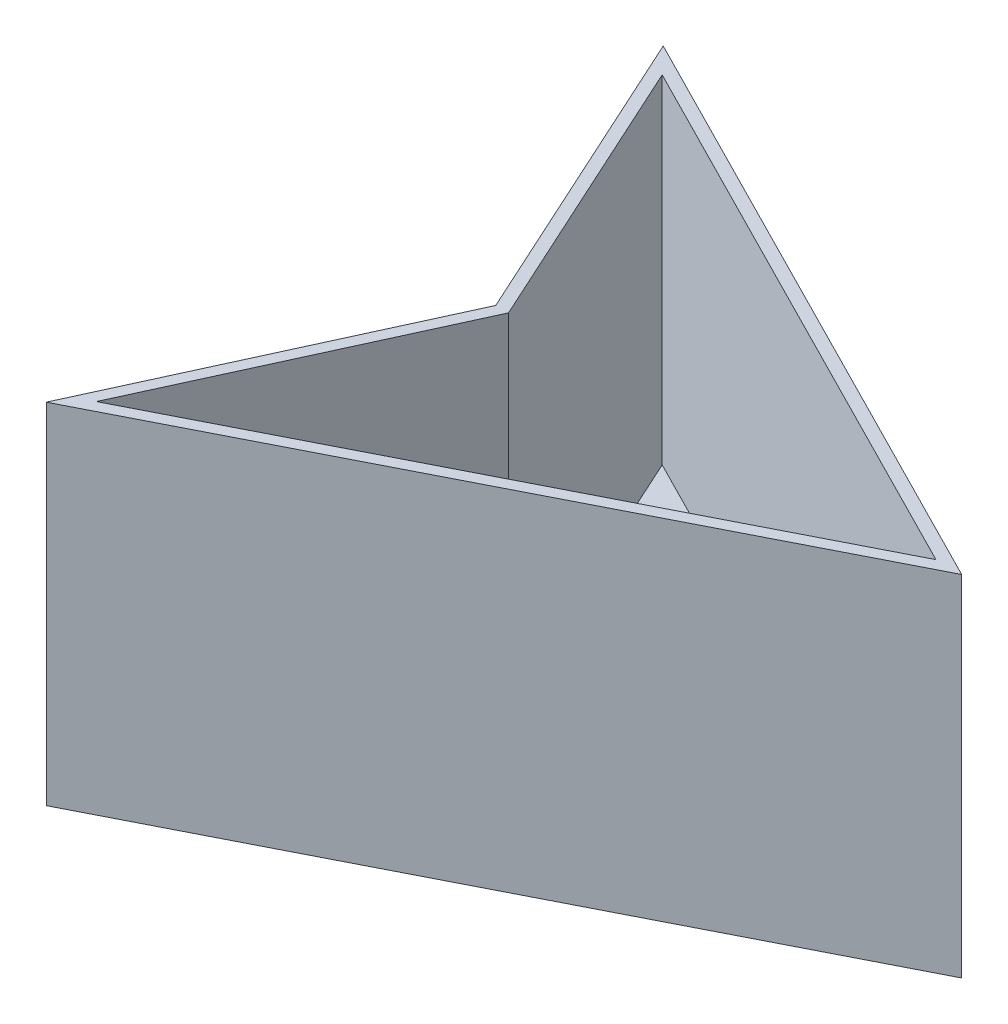
ISO-10303-21;
HEADER;
FILE_DESCRIPTION(('STEP AP214'),'2;1');
FILE_NAME('part.step','',(''),(''),'','','');
FILE_SCHEMA(('AUTOMOTIVE_DESIGN { 1 0 10303 214 1 1 1 1 }'));
ENDSEC;
DATA;
#1=APPLICATION_CONTEXT('core data for automotive mechanical design processes');
#2=APPLICATION_PROTOCOL_DEFINITION('international standard','automotive_design',2000,#1);
#3=PRODUCT_CONTEXT('',#1,'mechanical');
#4=PRODUCT('Part','Part','',(#3));
#5=PRODUCT_RELATED_PRODUCT_CATEGORY('part','',(#4));
#6=PRODUCT_DEFINITION_FORMATION('','',#4);
#7=PRODUCT_DEFINITION_CONTEXT('part definition',#1,'design');
#8=PRODUCT_DEFINITION('design','',#6,#7);
#9=PRODUCT_DEFINITION_SHAPE('','',#8);
#10=(LENGTH_UNIT() NAMED_UNIT(*) SI_UNIT(.MILLI.,.METRE.));
#11=(NAMED_UNIT(*) PLANE_ANGLE_UNIT() SI_UNIT($,.RADIAN.));
#12=(NAMED_UNIT(*) SI_UNIT($,.STERADIAN.) SOLID_ANGLE_UNIT());
#13=UNCERTAINTY_MEASURE_WITH_UNIT(LENGTH_MEASURE(1.E-05),#10,'distance_accuracy_value','');
#14=(GEOMETRIC_REPRESENTATION_CONTEXT(3) GLOBAL_UNCERTAINTY_ASSIGNED_CONTEXT((#13)) GLOBAL_UNIT_ASSIGNED_CONTEXT((#10,
#11,#12)) REPRESENTATION_CONTEXT('',''));
#15=CARTESIAN_POINT('',(0.,0.,0.));
#16=DIRECTION('',(0.,0.,1.));
#17=DIRECTION('',(1.,0.,0.));
#18=AXIS2_PLACEMENT_3D('',#15,#16,#17);
#19=CARTESIAN_POINT('',(-6.05,15.,13.2393448259509));
#20=DIRECTION('',(0.909533483579878,0.,0.415630656048194));
#21=DIRECTION('',(0.415630656048194,0.,-0.909533483579878));
#22=AXIS2_PLACEMENT_3D('',#19,#20,#21);
#23=PLANE('',#22);
#24=DIRECTION('',(-0.415630656048194,0.,0.909533483579878));
#25=VECTOR('',#24,1.);
#26=CARTESIAN_POINT('',(-6.05,0.,13.2393448259509));
#27=LINE('',#26,#25);
#28=CARTESIAN_POINT('',(0.,0.,0.));
#29=VERTEX_POINT('',#28);
#30=CARTESIAN_POINT('',(-6.05,0.,13.2393448259509));
#31=VERTEX_POINT('',#30);
#32=EDGE_CURVE('E151',#29,#31,#27,.T.);
#33=ORIENTED_EDGE('',*,*,#32,.T.);
#34=DIRECTION('',(0.,-1.,0.));
#35=VECTOR('',#34,1.);
#36=CARTESIAN_POINT('',(-6.05,15.,13.2393448259509));
#37=LINE('',#36,#35);
#38=CARTESIAN_POINT('',(-6.05,15.,13.2393448259509));
#39=VERTEX_POINT('',#38);
#40=EDGE_CURVE('E11',#39,#31,#37,.T.);
#41=ORIENTED_EDGE('',*,*,#40,.F.);
#42=DIRECTION('',(-0.415630656048194,0.,0.909533483579878));
#43=VECTOR('',#42,1.);
#44=CARTESIAN_POINT('',(-6.05,15.,13.2393448259509));
#45=LINE('',#44,#43);
#46=CARTESIAN_POINT('',(0.,15.,0.));
#47=VERTEX_POINT('',#46);
#48=EDGE_CURVE('E144',#47,#39,#45,.T.);
#49=ORIENTED_EDGE('',*,*,#48,.F.);
#50=DIRECTION('',(0.,-1.,0.));
#51=VECTOR('',#50,1.);
#52=CARTESIAN_POINT('',(0.,15.,0.));
#53=LINE('',#52,#51);
#54=EDGE_CURVE('E150',#47,#29,#53,.T.);
#55=ORIENTED_EDGE('',*,*,#54,.T.);
#56=EDGE_LOOP('',(#33,#41,#49,#55));
#57=FACE_BOUND('',#56,.T.);
#58=ADVANCED_FACE('F37',(#57),#23,.F.);
#59=CARTESIAN_POINT('',(20.,15.,0.));
#60=DIRECTION('',(-0.453072156354711,0.,-0.89147384770171));
#61=DIRECTION('',(-0.89147384770171,0.,0.453072156354711));
#62=AXIS2_PLACEMENT_3D('',#59,#60,#61);
#63=PLANE('',#62);
#64=DIRECTION('',(0.89147384770171,0.,-0.453072156354711));
#65=VECTOR('',#64,1.);
#66=CARTESIAN_POINT('',(20.,0.,0.));
#67=LINE('',#66,#65);
#68=CARTESIAN_POINT('',(20.,0.,0.));
#69=VERTEX_POINT('',#68);
#70=EDGE_CURVE('E154',#31,#69,#67,.T.);
#71=ORIENTED_EDGE('',*,*,#70,.T.);
#72=DIRECTION('',(0.,-1.,0.));
#73=VECTOR('',#72,1.);
#74=CARTESIAN_POINT('',(20.,15.,0.));
#75=LINE('',#74,#73);
#76=CARTESIAN_POINT('',(20.,15.,0.));
#77=VERTEX_POINT('',#76);
#78=EDGE_CURVE('E44',#77,#69,#75,.T.);
#79=ORIENTED_EDGE('',*,*,#78,.F.);
#80=DIRECTION('',(0.89147384770171,0.,-0.453072156354711));
#81=VECTOR('',#80,1.);
#82=CARTESIAN_POINT('',(20.,15.,0.));
#83=LINE('',#82,#81);
#84=EDGE_CURVE('E88',#39,#77,#83,.T.);
#85=ORIENTED_EDGE('',*,*,#84,.F.);
#86=ORIENTED_EDGE('',*,*,#40,.T.);
#87=EDGE_LOOP('',(#71,#79,#85,#86));
#88=FACE_BOUND('',#87,.T.);
#89=ADVANCED_FACE('F183',(#88),#63,.F.);
#90=CARTESIAN_POINT('',(20.,15.,0.));
#91=DIRECTION('',(-0.453072156354711,0.,0.89147384770171));
#92=DIRECTION('',(0.89147384770171,0.,0.453072156354711));
#93=AXIS2_PLACEMENT_3D('',#90,#91,#92);
#94=PLANE('',#93);
#95=DIRECTION('',(-0.89147384770171,0.,-0.453072156354711));
#96=VECTOR('',#95,1.);
#97=CARTESIAN_POINT('',(20.,0.,0.));
#98=LINE('',#97,#96);
#99=CARTESIAN_POINT('',(-6.05,0.,-13.2393448259509));
#100=VERTEX_POINT('',#99);
#101=EDGE_CURVE('E156',#69,#100,#98,.T.);
#102=ORIENTED_EDGE('',*,*,#101,.T.);
#103=DIRECTION('',(0.,-1.,0.));
#104=VECTOR('',#103,1.);
#105=CARTESIAN_POINT('',(-6.05,15.,-13.2393448259509));
#106=LINE('',#105,#104);
#107=CARTESIAN_POINT('',(-6.05,15.,-13.2393448259509));
#108=VERTEX_POINT('',#107);
#109=EDGE_CURVE('E160',#108,#100,#106,.T.);
#110=ORIENTED_EDGE('',*,*,#109,.F.);
#111=DIRECTION('',(-0.89147384770171,0.,-0.453072156354711));
#112=VECTOR('',#111,1.);
#113=CARTESIAN_POINT('',(20.,15.,0.));
#114=LINE('',#113,#112);
#115=EDGE_CURVE('E147',#77,#108,#114,.T.);
#116=ORIENTED_EDGE('',*,*,#115,.F.);
#117=ORIENTED_EDGE('',*,*,#78,.T.);
#118=EDGE_LOOP('',(#102,#110,#116,#117));
#119=FACE_BOUND('',#118,.T.);
#120=ADVANCED_FACE('F165',(#119),#94,.F.);
#121=CARTESIAN_POINT('',(-6.05,15.,-13.2393448259509));
#122=DIRECTION('',(0.909533483579878,0.,-0.415630656048194));
#123=DIRECTION('',(-0.415630656048194,0.,-0.909533483579878));
#124=AXIS2_PLACEMENT_3D('',#121,#122,#123);
#125=PLANE('',#124);
#126=DIRECTION('',(0.415630656048194,0.,0.909533483579878));
#127=VECTOR('',#126,1.);
#128=CARTESIAN_POINT('',(-6.05,0.,-13.2393448259509));
#129=LINE('',#128,#127);
#130=EDGE_CURVE('E81',#100,#29,#129,.T.);
#131=ORIENTED_EDGE('',*,*,#130,.T.);
#132=ORIENTED_EDGE('',*,*,#54,.F.);
#133=DIRECTION('',(0.415630656048194,0.,0.909533483579878));
#134=VECTOR('',#133,1.);
#135=CARTESIAN_POINT('',(-6.05,15.,-13.2393448259509));
#136=LINE('',#135,#134);
#137=EDGE_CURVE('E60',#108,#47,#136,.T.);
#138=ORIENTED_EDGE('',*,*,#137,.F.);
#139=ORIENTED_EDGE('',*,*,#109,.T.);
#140=EDGE_LOOP('',(#131,#132,#138,#139));
#141=FACE_BOUND('',#140,.T.);
#142=ADVANCED_FACE('F173',(#141),#125,.F.);
#143=CARTESIAN_POINT('',(0.,15.,0.));
#144=DIRECTION('',(0.,1.,0.));
#145=DIRECTION('',(0.,0.,1.));
#146=AXIS2_PLACEMENT_3D('',#143,#144,#145);
#147=PLANE('',#146);
#148=DIRECTION('',(-0.415630656048194,0.,0.909533483579878));
#149=VECTOR('',#148,1.);
#150=CARTESIAN_POINT('',(-5.59523325821006,15.,13.447160153975));
#151=LINE('',#150,#149);
#152=CARTESIAN_POINT('',(0.549732372723678,15.,0.));
#153=VERTEX_POINT('',#152);
#154=CARTESIAN_POINT('',(-5.00014154943411,15.,12.1449081976859));
#155=VERTEX_POINT('',#154);
#156=EDGE_CURVE('E133',#153,#155,#151,.T.);
#157=ORIENTED_EDGE('',*,*,#156,.F.);
#158=DIRECTION('',(0.415630656048194,0.,0.909533483579878));
#159=VECTOR('',#158,1.);
#160=CARTESIAN_POINT('',(-5.59523325821006,15.,-13.447160153975));
#161=LINE('',#160,#159);
#162=CARTESIAN_POINT('',(-5.00014154943411,15.,-12.1449081976859));
#163=VERTEX_POINT('',#162);
#164=EDGE_CURVE('E142',#163,#153,#161,.T.);
#165=ORIENTED_EDGE('',*,*,#164,.F.);
#166=DIRECTION('',(-0.891473847701711,0.,-0.453072156354711));
#167=VECTOR('',#166,1.);
#168=CARTESIAN_POINT('',(19.7734639218226,15.,0.445736923850855));
#169=LINE('',#168,#167);
#170=CARTESIAN_POINT('',(18.896423024485,15.,0.));
#171=VERTEX_POINT('',#170);
#172=EDGE_CURVE('E140',#171,#163,#169,.T.);
#173=ORIENTED_EDGE('',*,*,#172,.F.);
#174=DIRECTION('',(0.891473847701711,0.,-0.453072156354711));
#175=VECTOR('',#174,1.);
#176=CARTESIAN_POINT('',(19.7734639218226,15.,-0.445736923850855));
#177=LINE('',#176,#175);
#178=EDGE_CURVE('E125',#155,#171,#177,.T.);
#179=ORIENTED_EDGE('',*,*,#178,.F.);
#180=EDGE_LOOP('',(#157,#165,#173,#179));
#181=FACE_BOUND('',#180,.T.);
#182=ORIENTED_EDGE('',*,*,#48,.T.);
#183=ORIENTED_EDGE('',*,*,#84,.T.);
#184=ORIENTED_EDGE('',*,*,#115,.T.);
#185=ORIENTED_EDGE('',*,*,#137,.T.);
#186=EDGE_LOOP('',(#182,#183,#184,#185));
#187=FACE_BOUND('',#186,.T.);
#188=ADVANCED_FACE('F175',(#181,#187),#147,.T.);
#189=CARTESIAN_POINT('',(0.,0.,0.));
#190=DIRECTION('',(0.,1.,0.));
#191=DIRECTION('',(0.,0.,1.));
#192=AXIS2_PLACEMENT_3D('',#189,#190,#191);
#193=PLANE('',#192);
#194=ORIENTED_EDGE('',*,*,#32,.F.);
#195=ORIENTED_EDGE('',*,*,#130,.F.);
#196=ORIENTED_EDGE('',*,*,#101,.F.);
#197=ORIENTED_EDGE('',*,*,#70,.F.);
#198=EDGE_LOOP('',(#194,#195,#196,#197));
#199=FACE_BOUND('',#198,.T.);
#200=ADVANCED_FACE('F169',(#199),#193,.F.);
#201=CARTESIAN_POINT('',(-5.59523325821006,15.,13.447160153975));
#202=DIRECTION('',(0.909533483579878,0.,0.415630656048194));
#203=DIRECTION('',(0.415630656048194,0.,-0.909533483579878));
#204=AXIS2_PLACEMENT_3D('',#201,#202,#203);
#205=PLANE('',#204);
#206=DIRECTION('',(-0.415630656048194,0.,0.909533483579878));
#207=VECTOR('',#206,1.);
#208=CARTESIAN_POINT('',(-5.59523325821006,0.499999999999999,13.447160153975));
#209=LINE('',#208,#207);
#210=CARTESIAN_POINT('',(0.549732372723678,0.5,0.));
#211=VERTEX_POINT('',#210);
#212=CARTESIAN_POINT('',(-5.00014154943411,0.5,12.1449081976859));
#213=VERTEX_POINT('',#212);
#214=EDGE_CURVE('E116',#211,#213,#209,.T.);
#215=ORIENTED_EDGE('',*,*,#214,.F.);
#216=DIRECTION('',(0.,-1.,0.));
#217=VECTOR('',#216,1.);
#218=CARTESIAN_POINT('',(0.549732372723678,15.,0.));
#219=LINE('',#218,#217);
#220=EDGE_CURVE('E136',#153,#211,#219,.T.);
#221=ORIENTED_EDGE('',*,*,#220,.F.);
#222=ORIENTED_EDGE('',*,*,#156,.T.);
#223=DIRECTION('',(0.,-1.,0.));
#224=VECTOR('',#223,1.);
#225=CARTESIAN_POINT('',(-5.00014154943412,15.,12.1449081976859));
#226=LINE('',#225,#224);
#227=EDGE_CURVE('E128',#155,#213,#226,.T.);
#228=ORIENTED_EDGE('',*,*,#227,.T.);
#229=EDGE_LOOP('',(#215,#221,#222,#228));
#230=FACE_BOUND('',#229,.T.);
#231=ADVANCED_FACE('F212',(#230),#205,.T.);
#232=CARTESIAN_POINT('',(19.7734639218226,15.,-0.445736923850855));
#233=DIRECTION('',(-0.453072156354711,0.,-0.89147384770171));
#234=DIRECTION('',(-0.89147384770171,0.,0.453072156354711));
#235=AXIS2_PLACEMENT_3D('',#232,#233,#234);
#236=PLANE('',#235);
#237=DIRECTION('',(0.891473847701711,0.,-0.453072156354711));
#238=VECTOR('',#237,1.);
#239=CARTESIAN_POINT('',(19.7734639218226,0.499999999999999,-0.445736923850855));
#240=LINE('',#239,#238);
#241=CARTESIAN_POINT('',(18.896423024485,0.5,0.));
#242=VERTEX_POINT('',#241);
#243=EDGE_CURVE('E110',#213,#242,#240,.T.);
#244=ORIENTED_EDGE('',*,*,#243,.F.);
#245=ORIENTED_EDGE('',*,*,#227,.F.);
#246=ORIENTED_EDGE('',*,*,#178,.T.);
#247=DIRECTION('',(0.,-1.,0.));
#248=VECTOR('',#247,1.);
#249=CARTESIAN_POINT('',(18.896423024485,15.,0.));
#250=LINE('',#249,#248);
#251=EDGE_CURVE('E122',#171,#242,#250,.T.);
#252=ORIENTED_EDGE('',*,*,#251,.T.);
#253=EDGE_LOOP('',(#244,#245,#246,#252));
#254=FACE_BOUND('',#253,.T.);
#255=ADVANCED_FACE('F123',(#254),#236,.T.);
#256=CARTESIAN_POINT('',(19.7734639218226,15.,0.445736923850855));
#257=DIRECTION('',(-0.453072156354711,0.,0.89147384770171));
#258=DIRECTION('',(0.89147384770171,0.,0.453072156354711));
#259=AXIS2_PLACEMENT_3D('',#256,#257,#258);
#260=PLANE('',#259);
#261=DIRECTION('',(-0.891473847701711,0.,-0.453072156354711));
#262=VECTOR('',#261,1.);
#263=CARTESIAN_POINT('',(19.7734639218226,0.499999999999999,0.445736923850855));
#264=LINE('',#263,#262);
#265=CARTESIAN_POINT('',(-5.00014154943411,0.5,-12.1449081976859));
#266=VERTEX_POINT('',#265);
#267=EDGE_CURVE('E114',#242,#266,#264,.T.);
#268=ORIENTED_EDGE('',*,*,#267,.F.);
#269=ORIENTED_EDGE('',*,*,#251,.F.);
#270=ORIENTED_EDGE('',*,*,#172,.T.);
#271=DIRECTION('',(0.,-1.,0.));
#272=VECTOR('',#271,1.);
#273=CARTESIAN_POINT('',(-5.00014154943411,15.,-12.1449081976859));
#274=LINE('',#273,#272);
#275=EDGE_CURVE('E51',#163,#266,#274,.T.);
#276=ORIENTED_EDGE('',*,*,#275,.T.);
#277=EDGE_LOOP('',(#268,#269,#270,#276));
#278=FACE_BOUND('',#277,.T.);
#279=ADVANCED_FACE('F130',(#278),#260,.T.);
#280=CARTESIAN_POINT('',(-5.59523325821006,15.,-13.447160153975));
#281=DIRECTION('',(0.909533483579878,0.,-0.415630656048194));
#282=DIRECTION('',(-0.415630656048194,0.,-0.909533483579878));
#283=AXIS2_PLACEMENT_3D('',#280,#281,#282);
#284=PLANE('',#283);
#285=DIRECTION('',(0.415630656048194,0.,0.909533483579878));
#286=VECTOR('',#285,1.);
#287=CARTESIAN_POINT('',(-5.59523325821006,0.499999999999999,-13.447160153975));
#288=LINE('',#287,#286);
#289=EDGE_CURVE('E131',#266,#211,#288,.T.);
#290=ORIENTED_EDGE('',*,*,#289,.F.);
#291=ORIENTED_EDGE('',*,*,#275,.F.);
#292=ORIENTED_EDGE('',*,*,#164,.T.);
#293=ORIENTED_EDGE('',*,*,#220,.T.);
#294=EDGE_LOOP('',(#290,#291,#292,#293));
#295=FACE_BOUND('',#294,.T.);
#296=ADVANCED_FACE('F246',(#295),#284,.T.);
#297=CARTESIAN_POINT('',(0.,0.5,0.));
#298=DIRECTION('',(0.,1.,0.));
#299=DIRECTION('',(0.,0.,1.));
#300=AXIS2_PLACEMENT_3D('',#297,#298,#299);
#301=PLANE('',#300);
#302=ORIENTED_EDGE('',*,*,#214,.T.);
#303=ORIENTED_EDGE('',*,*,#243,.T.);
#304=ORIENTED_EDGE('',*,*,#267,.T.);
#305=ORIENTED_EDGE('',*,*,#289,.T.);
#306=EDGE_LOOP('',(#302,#303,#304,#305));
#307=FACE_BOUND('',#306,.T.);
#308=ADVANCED_FACE('F112',(#307),#301,.T.);
#309=CLOSED_SHELL('',(#58,#89,#120,#142,#188,#200,#231,#255,#279,#296,#308));
#310=MANIFOLD_SOLID_BREP('B2',#309);
#311=ADVANCED_BREP_SHAPE_REPRESENTATION('',(#18,#310),#14);
#312=SHAPE_DEFINITION_REPRESENTATION(#9,#311);
ENDSEC;
END-ISO-10303-21;
